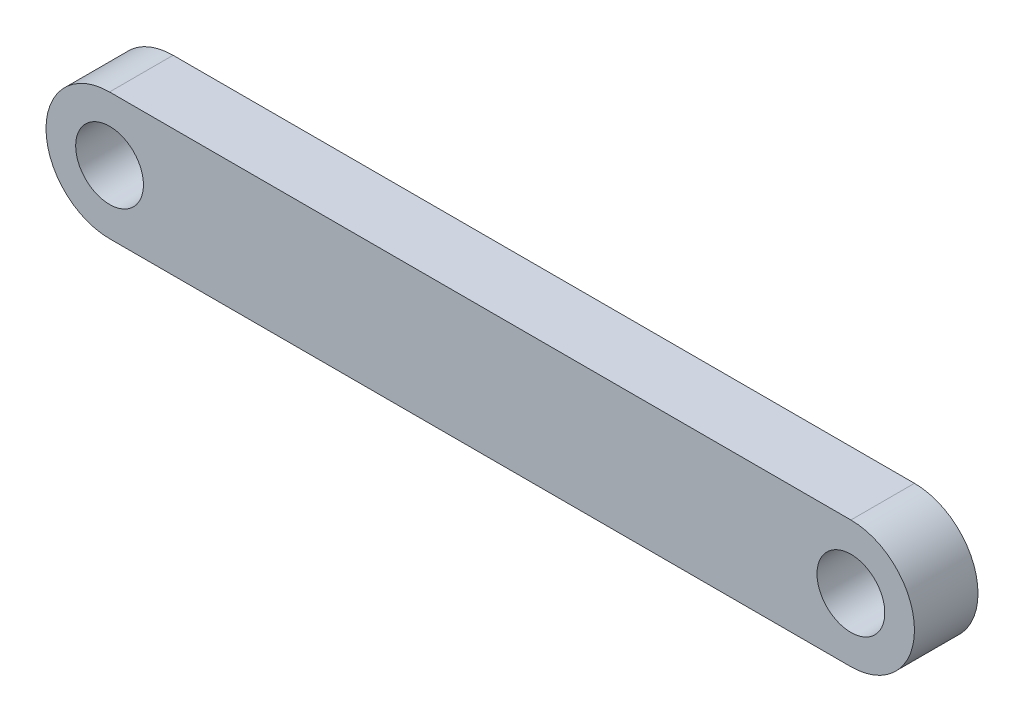
ISO-10303-21;
HEADER;
FILE_DESCRIPTION(('STEP AP214'),'2;1');
FILE_NAME('part.step','',(''),(''),'','','');
FILE_SCHEMA(('AUTOMOTIVE_DESIGN { 1 0 10303 214 1 1 1 1 }'));
ENDSEC;
DATA;
#1=APPLICATION_CONTEXT('core data for automotive mechanical design processes');
#2=APPLICATION_PROTOCOL_DEFINITION('international standard','automotive_design',2000,#1);
#3=PRODUCT_CONTEXT('',#1,'mechanical');
#4=PRODUCT('Part','Part','',(#3));
#5=PRODUCT_RELATED_PRODUCT_CATEGORY('part','',(#4));
#6=PRODUCT_DEFINITION_FORMATION('','',#4);
#7=PRODUCT_DEFINITION_CONTEXT('part definition',#1,'design');
#8=PRODUCT_DEFINITION('design','',#6,#7);
#9=PRODUCT_DEFINITION_SHAPE('','',#8);
#10=(LENGTH_UNIT() NAMED_UNIT(*) SI_UNIT(.MILLI.,.METRE.));
#11=(NAMED_UNIT(*) PLANE_ANGLE_UNIT() SI_UNIT($,.RADIAN.));
#12=(NAMED_UNIT(*) SI_UNIT($,.STERADIAN.) SOLID_ANGLE_UNIT());
#13=UNCERTAINTY_MEASURE_WITH_UNIT(LENGTH_MEASURE(1.E-05),#10,'distance_accuracy_value','');
#14=(GEOMETRIC_REPRESENTATION_CONTEXT(3) GLOBAL_UNCERTAINTY_ASSIGNED_CONTEXT((#13)) GLOBAL_UNIT_ASSIGNED_CONTEXT((#10,
#11,#12)) REPRESENTATION_CONTEXT('',''));
#15=CARTESIAN_POINT('',(0.,0.,0.));
#16=DIRECTION('',(0.,0.,1.));
#17=DIRECTION('',(1.,0.,0.));
#18=AXIS2_PLACEMENT_3D('',#15,#16,#17);
#19=CARTESIAN_POINT('',(35.,0.,0.));
#20=DIRECTION('',(0.,0.,1.));
#21=DIRECTION('',(1.,0.,0.));
#22=AXIS2_PLACEMENT_3D('',#19,#20,#21);
#23=CYLINDRICAL_SURFACE('',#22,3.);
#24=CARTESIAN_POINT('',(35.,0.,3.));
#25=DIRECTION('',(0.,0.,1.));
#26=DIRECTION('',(1.,0.,0.));
#27=AXIS2_PLACEMENT_3D('',#24,#25,#26);
#28=CIRCLE('',#27,3.);
#29=CARTESIAN_POINT('',(35.,-3.,3.));
#30=VERTEX_POINT('',#29);
#31=CARTESIAN_POINT('',(35.,3.,3.));
#32=VERTEX_POINT('',#31);
#33=EDGE_CURVE('E99',#30,#32,#28,.T.);
#34=ORIENTED_EDGE('',*,*,#33,.F.);
#35=DIRECTION('',(0.,0.,1.));
#36=VECTOR('',#35,1.);
#37=CARTESIAN_POINT('',(35.,-3.,0.));
#38=LINE('',#37,#36);
#39=CARTESIAN_POINT('',(35.,-3.,0.));
#40=VERTEX_POINT('',#39);
#41=EDGE_CURVE('E11',#40,#30,#38,.T.);
#42=ORIENTED_EDGE('',*,*,#41,.F.);
#43=CARTESIAN_POINT('',(35.,0.,0.));
#44=DIRECTION('',(0.,0.,1.));
#45=DIRECTION('',(1.,0.,0.));
#46=AXIS2_PLACEMENT_3D('',#43,#44,#45);
#47=CIRCLE('',#46,3.);
#48=CARTESIAN_POINT('',(35.,3.,0.));
#49=VERTEX_POINT('',#48);
#50=EDGE_CURVE('E92',#40,#49,#47,.T.);
#51=ORIENTED_EDGE('',*,*,#50,.T.);
#52=DIRECTION('',(0.,0.,1.));
#53=VECTOR('',#52,1.);
#54=CARTESIAN_POINT('',(35.,3.,0.));
#55=LINE('',#54,#53);
#56=EDGE_CURVE('E37',#49,#32,#55,.T.);
#57=ORIENTED_EDGE('',*,*,#56,.T.);
#58=EDGE_LOOP('',(#34,#42,#51,#57));
#59=FACE_BOUND('',#58,.T.);
#60=ADVANCED_FACE('F34',(#59),#23,.T.);
#61=CARTESIAN_POINT('',(0.,-3.,0.));
#62=DIRECTION('',(0.,-1.,0.));
#63=DIRECTION('',(0.,0.,-1.));
#64=AXIS2_PLACEMENT_3D('',#61,#62,#63);
#65=PLANE('',#64);
#66=DIRECTION('',(1.,0.,0.));
#67=VECTOR('',#66,1.);
#68=CARTESIAN_POINT('',(0.,-3.,3.));
#69=LINE('',#68,#67);
#70=CARTESIAN_POINT('',(0.,-3.,3.));
#71=VERTEX_POINT('',#70);
#72=EDGE_CURVE('E94',#71,#30,#69,.T.);
#73=ORIENTED_EDGE('',*,*,#72,.F.);
#74=DIRECTION('',(0.,0.,1.));
#75=VECTOR('',#74,1.);
#76=CARTESIAN_POINT('',(0.,-3.,0.));
#77=LINE('',#76,#75);
#78=CARTESIAN_POINT('',(0.,-3.,0.));
#79=VERTEX_POINT('',#78);
#80=EDGE_CURVE('E43',#79,#71,#77,.T.);
#81=ORIENTED_EDGE('',*,*,#80,.F.);
#82=DIRECTION('',(1.,0.,0.));
#83=VECTOR('',#82,1.);
#84=CARTESIAN_POINT('',(0.,-3.,0.));
#85=LINE('',#84,#83);
#86=EDGE_CURVE('E89',#79,#40,#85,.T.);
#87=ORIENTED_EDGE('',*,*,#86,.T.);
#88=ORIENTED_EDGE('',*,*,#41,.T.);
#89=EDGE_LOOP('',(#73,#81,#87,#88));
#90=FACE_BOUND('',#89,.T.);
#91=ADVANCED_FACE('F110',(#90),#65,.T.);
#92=CARTESIAN_POINT('',(0.,0.,0.));
#93=DIRECTION('',(0.,0.,1.));
#94=DIRECTION('',(1.,0.,0.));
#95=AXIS2_PLACEMENT_3D('',#92,#93,#94);
#96=CYLINDRICAL_SURFACE('',#95,3.);
#97=CARTESIAN_POINT('',(0.,0.,3.));
#98=DIRECTION('',(0.,0.,1.));
#99=DIRECTION('',(1.,0.,0.));
#100=AXIS2_PLACEMENT_3D('',#97,#98,#99);
#101=CIRCLE('',#100,3.);
#102=CARTESIAN_POINT('',(0.,3.,3.));
#103=VERTEX_POINT('',#102);
#104=EDGE_CURVE('E84',#103,#71,#101,.T.);
#105=ORIENTED_EDGE('',*,*,#104,.F.);
#106=DIRECTION('',(0.,0.,1.));
#107=VECTOR('',#106,1.);
#108=CARTESIAN_POINT('',(0.,3.,0.));
#109=LINE('',#108,#107);
#110=CARTESIAN_POINT('',(0.,3.,0.));
#111=VERTEX_POINT('',#110);
#112=EDGE_CURVE('E79',#111,#103,#109,.T.);
#113=ORIENTED_EDGE('',*,*,#112,.F.);
#114=CARTESIAN_POINT('',(0.,0.,0.));
#115=DIRECTION('',(0.,0.,1.));
#116=DIRECTION('',(1.,0.,0.));
#117=AXIS2_PLACEMENT_3D('',#114,#115,#116);
#118=CIRCLE('',#117,3.);
#119=EDGE_CURVE('E82',#111,#79,#118,.T.);
#120=ORIENTED_EDGE('',*,*,#119,.T.);
#121=ORIENTED_EDGE('',*,*,#80,.T.);
#122=EDGE_LOOP('',(#105,#113,#120,#121));
#123=FACE_BOUND('',#122,.T.);
#124=ADVANCED_FACE('F81',(#123),#96,.T.);
#125=CARTESIAN_POINT('',(35.,3.,0.));
#126=DIRECTION('',(0.,1.,0.));
#127=DIRECTION('',(0.,0.,1.));
#128=AXIS2_PLACEMENT_3D('',#125,#126,#127);
#129=PLANE('',#128);
#130=DIRECTION('',(-1.,0.,0.));
#131=VECTOR('',#130,1.);
#132=CARTESIAN_POINT('',(35.,3.,3.));
#133=LINE('',#132,#131);
#134=EDGE_CURVE('E102',#32,#103,#133,.T.);
#135=ORIENTED_EDGE('',*,*,#134,.F.);
#136=ORIENTED_EDGE('',*,*,#56,.F.);
#137=DIRECTION('',(-1.,0.,0.));
#138=VECTOR('',#137,1.);
#139=CARTESIAN_POINT('',(35.,3.,0.));
#140=LINE('',#139,#138);
#141=EDGE_CURVE('E88',#49,#111,#140,.T.);
#142=ORIENTED_EDGE('',*,*,#141,.T.);
#143=ORIENTED_EDGE('',*,*,#112,.T.);
#144=EDGE_LOOP('',(#135,#136,#142,#143));
#145=FACE_BOUND('',#144,.T.);
#146=ADVANCED_FACE('F91',(#145),#129,.T.);
#147=CARTESIAN_POINT('',(35.,0.,0.));
#148=DIRECTION('',(0.,0.,1.));
#149=DIRECTION('',(1.,0.,0.));
#150=AXIS2_PLACEMENT_3D('',#147,#148,#149);
#151=PLANE('',#150);
#152=CARTESIAN_POINT('',(0.,0.,0.));
#153=DIRECTION('',(0.,0.,1.));
#154=DIRECTION('',(-1.,0.,0.));
#155=AXIS2_PLACEMENT_3D('',#152,#153,#154);
#156=CIRCLE('',#155,1.6);
#157=CARTESIAN_POINT('',(-1.6,0.,0.));
#158=VERTEX_POINT('',#157);
#159=EDGE_CURVE('E143',#158,#158,#156,.T.);
#160=ORIENTED_EDGE('',*,*,#159,.T.);
#161=EDGE_LOOP('',(#160));
#162=FACE_BOUND('',#161,.T.);
#163=CARTESIAN_POINT('',(35.,0.,0.));
#164=DIRECTION('',(0.,0.,1.));
#165=DIRECTION('',(-1.,0.,0.));
#166=AXIS2_PLACEMENT_3D('',#163,#164,#165);
#167=CIRCLE('',#166,1.6);
#168=CARTESIAN_POINT('',(33.4,0.,0.));
#169=VERTEX_POINT('',#168);
#170=EDGE_CURVE('E103',#169,#169,#167,.T.);
#171=ORIENTED_EDGE('',*,*,#170,.T.);
#172=EDGE_LOOP('',(#171));
#173=FACE_BOUND('',#172,.T.);
#174=ORIENTED_EDGE('',*,*,#50,.F.);
#175=ORIENTED_EDGE('',*,*,#86,.F.);
#176=ORIENTED_EDGE('',*,*,#119,.F.);
#177=ORIENTED_EDGE('',*,*,#141,.F.);
#178=EDGE_LOOP('',(#174,#175,#176,#177));
#179=FACE_BOUND('',#178,.T.);
#180=ADVANCED_FACE('F87',(#162,#173,#179),#151,.F.);
#181=CARTESIAN_POINT('',(35.,0.,3.));
#182=DIRECTION('',(0.,0.,1.));
#183=DIRECTION('',(1.,0.,0.));
#184=AXIS2_PLACEMENT_3D('',#181,#182,#183);
#185=PLANE('',#184);
#186=CARTESIAN_POINT('',(0.,0.,3.));
#187=DIRECTION('',(0.,0.,1.));
#188=DIRECTION('',(-1.,0.,0.));
#189=AXIS2_PLACEMENT_3D('',#186,#187,#188);
#190=CIRCLE('',#189,1.6);
#191=CARTESIAN_POINT('',(-1.6,0.,3.));
#192=VERTEX_POINT('',#191);
#193=EDGE_CURVE('E146',#192,#192,#190,.T.);
#194=ORIENTED_EDGE('',*,*,#193,.F.);
#195=EDGE_LOOP('',(#194));
#196=FACE_BOUND('',#195,.T.);
#197=CARTESIAN_POINT('',(35.,0.,3.));
#198=DIRECTION('',(0.,0.,1.));
#199=DIRECTION('',(-1.,0.,0.));
#200=AXIS2_PLACEMENT_3D('',#197,#198,#199);
#201=CIRCLE('',#200,1.6);
#202=CARTESIAN_POINT('',(33.4,0.,3.));
#203=VERTEX_POINT('',#202);
#204=EDGE_CURVE('E148',#203,#203,#201,.T.);
#205=ORIENTED_EDGE('',*,*,#204,.F.);
#206=EDGE_LOOP('',(#205));
#207=FACE_BOUND('',#206,.T.);
#208=ORIENTED_EDGE('',*,*,#33,.T.);
#209=ORIENTED_EDGE('',*,*,#134,.T.);
#210=ORIENTED_EDGE('',*,*,#104,.T.);
#211=ORIENTED_EDGE('',*,*,#72,.T.);
#212=EDGE_LOOP('',(#208,#209,#210,#211));
#213=FACE_BOUND('',#212,.T.);
#214=ADVANCED_FACE('F109',(#196,#207,#213),#185,.T.);
#215=CARTESIAN_POINT('',(35.,0.,0.));
#216=DIRECTION('',(0.,0.,1.));
#217=DIRECTION('',(1.,0.,0.));
#218=AXIS2_PLACEMENT_3D('',#215,#216,#217);
#219=CYLINDRICAL_SURFACE('',#218,1.6);
#220=ORIENTED_EDGE('',*,*,#170,.F.);
#221=EDGE_LOOP('',(#220));
#222=FACE_BOUND('',#221,.T.);
#223=ORIENTED_EDGE('',*,*,#204,.T.);
#224=EDGE_LOOP('',(#223));
#225=FACE_BOUND('',#224,.T.);
#226=ADVANCED_FACE('F128',(#222,#225),#219,.F.);
#227=CARTESIAN_POINT('',(0.,0.,0.));
#228=DIRECTION('',(0.,0.,1.));
#229=DIRECTION('',(1.,0.,0.));
#230=AXIS2_PLACEMENT_3D('',#227,#228,#229);
#231=CYLINDRICAL_SURFACE('',#230,1.6);
#232=ORIENTED_EDGE('',*,*,#159,.F.);
#233=EDGE_LOOP('',(#232));
#234=FACE_BOUND('',#233,.T.);
#235=ORIENTED_EDGE('',*,*,#193,.T.);
#236=EDGE_LOOP('',(#235));
#237=FACE_BOUND('',#236,.T.);
#238=ADVANCED_FACE('F135',(#234,#237),#231,.F.);
#239=CLOSED_SHELL('',(#60,#91,#124,#146,#180,#214,#226,#238));
#240=MANIFOLD_SOLID_BREP('B2',#239);
#241=ADVANCED_BREP_SHAPE_REPRESENTATION('',(#18,#240),#14);
#242=SHAPE_DEFINITION_REPRESENTATION(#9,#241);
ENDSEC;
END-ISO-10303-21;
